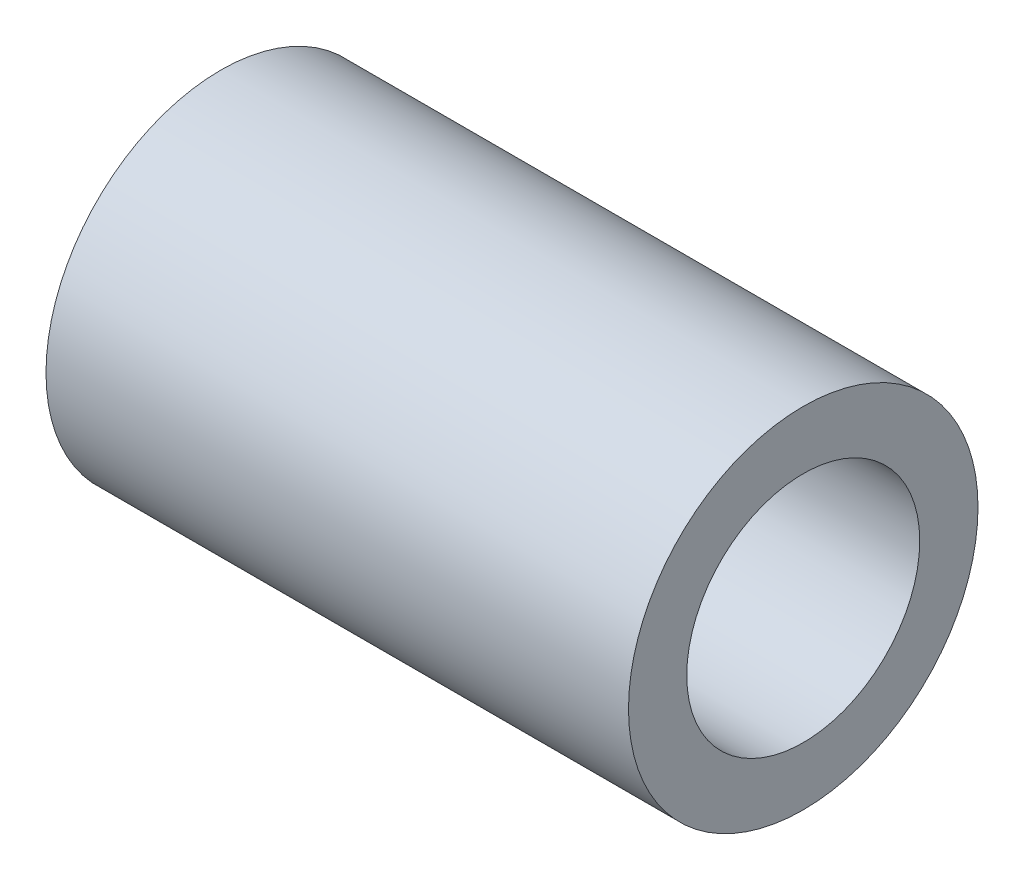
ISO-10303-21;
HEADER;
FILE_DESCRIPTION(('STEP AP214'),'2;1');
FILE_NAME('part.step','',(''),(''),'','','');
FILE_SCHEMA(('AUTOMOTIVE_DESIGN { 1 0 10303 214 1 1 1 1 }'));
ENDSEC;
DATA;
#1=APPLICATION_CONTEXT('core data for automotive mechanical design processes');
#2=APPLICATION_PROTOCOL_DEFINITION('international standard','automotive_design',2000,#1);
#3=PRODUCT_CONTEXT('',#1,'mechanical');
#4=PRODUCT('Part','Part','',(#3));
#5=PRODUCT_RELATED_PRODUCT_CATEGORY('part','',(#4));
#6=PRODUCT_DEFINITION_FORMATION('','',#4);
#7=PRODUCT_DEFINITION_CONTEXT('part definition',#1,'design');
#8=PRODUCT_DEFINITION('design','',#6,#7);
#9=PRODUCT_DEFINITION_SHAPE('','',#8);
#10=(LENGTH_UNIT() NAMED_UNIT(*) SI_UNIT(.MILLI.,.METRE.));
#11=(NAMED_UNIT(*) PLANE_ANGLE_UNIT() SI_UNIT($,.RADIAN.));
#12=(NAMED_UNIT(*) SI_UNIT($,.STERADIAN.) SOLID_ANGLE_UNIT());
#13=UNCERTAINTY_MEASURE_WITH_UNIT(LENGTH_MEASURE(1.E-05),#10,'distance_accuracy_value','');
#14=(GEOMETRIC_REPRESENTATION_CONTEXT(3) GLOBAL_UNCERTAINTY_ASSIGNED_CONTEXT((#13)) GLOBAL_UNIT_ASSIGNED_CONTEXT((#10,
#11,#12)) REPRESENTATION_CONTEXT('',''));
#15=CARTESIAN_POINT('',(0.,0.,0.));
#16=DIRECTION('',(0.,0.,1.));
#17=DIRECTION('',(1.,0.,0.));
#18=AXIS2_PLACEMENT_3D('',#15,#16,#17);
#19=CARTESIAN_POINT('',(742.,1070.,514.999999999995));
#20=DIRECTION('',(-1.,0.,0.));
#21=DIRECTION('',(0.,0.,1.));
#22=AXIS2_PLACEMENT_3D('',#19,#20,#21);
#23=CYLINDRICAL_SURFACE('',#22,15.);
#24=CARTESIAN_POINT('',(742.,1070.,514.999999999995));
#25=DIRECTION('',(-1.,0.,0.));
#26=DIRECTION('',(0.,0.,1.));
#27=AXIS2_PLACEMENT_3D('',#24,#25,#26);
#28=CIRCLE('',#27,15.);
#29=CARTESIAN_POINT('',(742.,1070.,529.999999999995));
#30=VERTEX_POINT('',#29);
#31=EDGE_CURVE('E47',#30,#30,#28,.T.);
#32=ORIENTED_EDGE('',*,*,#31,.T.);
#33=EDGE_LOOP('',(#32));
#34=FACE_BOUND('',#33,.T.);
#35=CARTESIAN_POINT('',(692.,1070.,514.999999999995));
#36=DIRECTION('',(-1.,0.,0.));
#37=DIRECTION('',(0.,0.,1.));
#38=AXIS2_PLACEMENT_3D('',#35,#36,#37);
#39=CIRCLE('',#38,15.);
#40=CARTESIAN_POINT('',(692.,1070.,529.999999999995));
#41=VERTEX_POINT('',#40);
#42=EDGE_CURVE('E51',#41,#41,#39,.T.);
#43=ORIENTED_EDGE('',*,*,#42,.F.);
#44=EDGE_LOOP('',(#43));
#45=FACE_BOUND('',#44,.T.);
#46=ADVANCED_FACE('F35',(#34,#45),#23,.T.);
#47=CARTESIAN_POINT('',(742.,1070.,514.999999999995));
#48=DIRECTION('',(-1.,0.,0.));
#49=DIRECTION('',(0.,0.,1.));
#50=AXIS2_PLACEMENT_3D('',#47,#48,#49);
#51=PLANE('',#50);
#52=CARTESIAN_POINT('',(742.,1070.,514.999999999995));
#53=DIRECTION('',(-1.,0.,0.));
#54=DIRECTION('',(0.,0.,1.));
#55=AXIS2_PLACEMENT_3D('',#52,#53,#54);
#56=CIRCLE('',#55,9.99999999999998);
#57=CARTESIAN_POINT('',(742.,1070.,524.999999999995));
#58=VERTEX_POINT('',#57);
#59=EDGE_CURVE('E55',#58,#58,#56,.T.);
#60=ORIENTED_EDGE('',*,*,#59,.T.);
#61=EDGE_LOOP('',(#60));
#62=FACE_BOUND('',#61,.T.);
#63=ORIENTED_EDGE('',*,*,#31,.F.);
#64=EDGE_LOOP('',(#63));
#65=FACE_BOUND('',#64,.T.);
#66=ADVANCED_FACE('F60',(#62,#65),#51,.F.);
#67=CARTESIAN_POINT('',(692.,1070.,514.999999999995));
#68=DIRECTION('',(-1.,0.,0.));
#69=DIRECTION('',(0.,0.,1.));
#70=AXIS2_PLACEMENT_3D('',#67,#68,#69);
#71=PLANE('',#70);
#72=CARTESIAN_POINT('',(692.,1070.,514.999999999995));
#73=DIRECTION('',(-1.,0.,0.));
#74=DIRECTION('',(0.,0.,1.));
#75=AXIS2_PLACEMENT_3D('',#72,#73,#74);
#76=CIRCLE('',#75,12.);
#77=CARTESIAN_POINT('',(692.,1070.,526.999999999995));
#78=VERTEX_POINT('',#77);
#79=EDGE_CURVE('E10',#78,#78,#76,.F.);
#80=ORIENTED_EDGE('',*,*,#79,.T.);
#81=EDGE_LOOP('',(#80));
#82=FACE_BOUND('',#81,.T.);
#83=ORIENTED_EDGE('',*,*,#42,.T.);
#84=EDGE_LOOP('',(#83));
#85=FACE_BOUND('',#84,.T.);
#86=ADVANCED_FACE('F65',(#82,#85),#71,.T.);
#87=CARTESIAN_POINT('',(742.,1070.,514.999999999995));
#88=DIRECTION('',(-1.,0.,0.));
#89=DIRECTION('',(0.,0.,1.));
#90=AXIS2_PLACEMENT_3D('',#87,#88,#89);
#91=CYLINDRICAL_SURFACE('',#90,9.99999999999998);
#92=CARTESIAN_POINT('',(694.,1070.,514.999999999995));
#93=DIRECTION('',(-1.,0.,0.));
#94=DIRECTION('',(0.,0.,1.));
#95=AXIS2_PLACEMENT_3D('',#92,#93,#94);
#96=CIRCLE('',#95,9.99999999999998);
#97=CARTESIAN_POINT('',(694.,1070.,524.999999999995));
#98=VERTEX_POINT('',#97);
#99=EDGE_CURVE('E43',#98,#98,#96,.T.);
#100=ORIENTED_EDGE('',*,*,#99,.T.);
#101=EDGE_LOOP('',(#100));
#102=FACE_BOUND('',#101,.T.);
#103=ORIENTED_EDGE('',*,*,#59,.F.);
#104=EDGE_LOOP('',(#103));
#105=FACE_BOUND('',#104,.T.);
#106=ADVANCED_FACE('F63',(#102,#105),#91,.F.);
#107=CARTESIAN_POINT('',(694.,1070.,514.999999999995));
#108=DIRECTION('',(-1.,0.,0.));
#109=DIRECTION('',(0.,0.,1.));
#110=AXIS2_PLACEMENT_3D('',#107,#108,#109);
#111=CONICAL_SURFACE('',#110,9.99999999999998,0.785398163397441);
#112=ORIENTED_EDGE('',*,*,#79,.F.);
#113=EDGE_LOOP('',(#112));
#114=FACE_BOUND('',#113,.T.);
#115=ORIENTED_EDGE('',*,*,#99,.F.);
#116=EDGE_LOOP('',(#115));
#117=FACE_BOUND('',#116,.T.);
#118=ADVANCED_FACE('F38',(#114,#117),#111,.F.);
#119=CLOSED_SHELL('',(#46,#66,#86,#106,#118));
#120=MANIFOLD_SOLID_BREP('B2',#119);
#121=ADVANCED_BREP_SHAPE_REPRESENTATION('',(#18,#120),#14);
#122=SHAPE_DEFINITION_REPRESENTATION(#9,#121);
ENDSEC;
END-ISO-10303-21;
